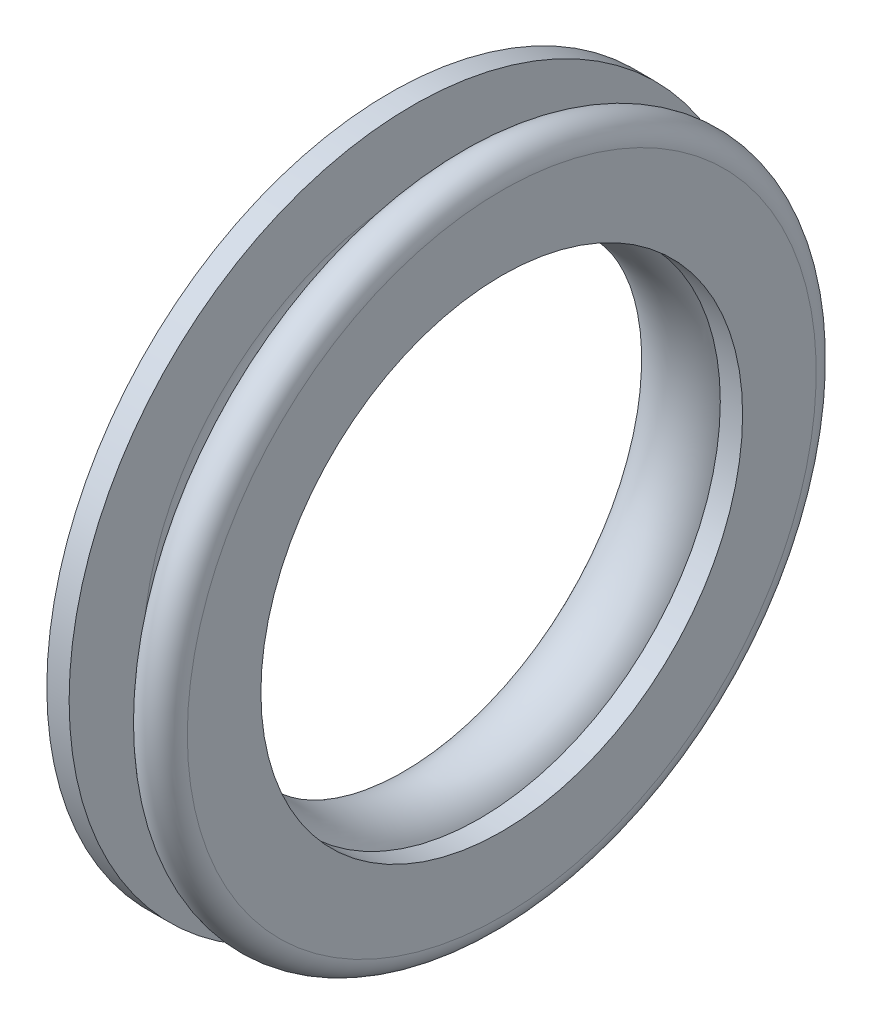
ISO-10303-21;
HEADER;
FILE_DESCRIPTION(('STEP AP214'),'2;1');
FILE_NAME('part.step','',(''),(''),'','','');
FILE_SCHEMA(('AUTOMOTIVE_DESIGN { 1 0 10303 214 1 1 1 1 }'));
ENDSEC;
DATA;
#1=APPLICATION_CONTEXT('core data for automotive mechanical design processes');
#2=APPLICATION_PROTOCOL_DEFINITION('international standard','automotive_design',2000,#1);
#3=PRODUCT_CONTEXT('',#1,'mechanical');
#4=PRODUCT('Part','Part','',(#3));
#5=PRODUCT_RELATED_PRODUCT_CATEGORY('part','',(#4));
#6=PRODUCT_DEFINITION_FORMATION('','',#4);
#7=PRODUCT_DEFINITION_CONTEXT('part definition',#1,'design');
#8=PRODUCT_DEFINITION('design','',#6,#7);
#9=PRODUCT_DEFINITION_SHAPE('','',#8);
#10=(LENGTH_UNIT() NAMED_UNIT(*) SI_UNIT(.MILLI.,.METRE.));
#11=(NAMED_UNIT(*) PLANE_ANGLE_UNIT() SI_UNIT($,.RADIAN.));
#12=(NAMED_UNIT(*) SI_UNIT($,.STERADIAN.) SOLID_ANGLE_UNIT());
#13=UNCERTAINTY_MEASURE_WITH_UNIT(LENGTH_MEASURE(1.E-05),#10,'distance_accuracy_value','');
#14=(GEOMETRIC_REPRESENTATION_CONTEXT(3) GLOBAL_UNCERTAINTY_ASSIGNED_CONTEXT((#13)) GLOBAL_UNIT_ASSIGNED_CONTEXT((#10,
#11,#12)) REPRESENTATION_CONTEXT('',''));
#15=CARTESIAN_POINT('',(0.,0.,0.));
#16=DIRECTION('',(0.,0.,1.));
#17=DIRECTION('',(1.,0.,0.));
#18=AXIS2_PLACEMENT_3D('',#15,#16,#17);
#19=CARTESIAN_POINT('',(0.,0.,0.));
#20=DIRECTION('',(-1.,0.,0.));
#21=DIRECTION('',(0.,0.,1.));
#22=AXIS2_PLACEMENT_3D('',#19,#20,#21);
#23=CYLINDRICAL_SURFACE('',#22,7.7);
#24=CARTESIAN_POINT('',(0.,0.,0.));
#25=DIRECTION('',(-1.,0.,0.));
#26=DIRECTION('',(0.,0.,1.));
#27=AXIS2_PLACEMENT_3D('',#24,#25,#26);
#28=CIRCLE('',#27,7.7);
#29=CARTESIAN_POINT('',(0.,0.,7.7));
#30=VERTEX_POINT('',#29);
#31=EDGE_CURVE('E10',#30,#30,#28,.T.);
#32=ORIENTED_EDGE('',*,*,#31,.F.);
#33=EDGE_LOOP('',(#32));
#34=FACE_BOUND('',#33,.T.);
#35=CARTESIAN_POINT('',(0.5,0.,0.));
#36=DIRECTION('',(-1.,0.,0.));
#37=DIRECTION('',(0.,0.,1.));
#38=AXIS2_PLACEMENT_3D('',#35,#36,#37);
#39=CIRCLE('',#38,7.7);
#40=CARTESIAN_POINT('',(0.5,0.,7.7));
#41=VERTEX_POINT('',#40);
#42=EDGE_CURVE('E66',#41,#41,#39,.T.);
#43=ORIENTED_EDGE('',*,*,#42,.T.);
#44=EDGE_LOOP('',(#43));
#45=FACE_BOUND('',#44,.T.);
#46=ADVANCED_FACE('F32',(#34,#45),#23,.T.);
#47=CARTESIAN_POINT('',(0.,7.7,0.));
#48=DIRECTION('',(1.,0.,0.));
#49=DIRECTION('',(0.,0.,-1.));
#50=AXIS2_PLACEMENT_3D('',#47,#48,#49);
#51=PLANE('',#50);
#52=CARTESIAN_POINT('',(0.,0.,0.));
#53=DIRECTION('',(-1.,0.,0.));
#54=DIRECTION('',(0.,0.,1.));
#55=AXIS2_PLACEMENT_3D('',#52,#53,#54);
#56=CIRCLE('',#55,6.05);
#57=CARTESIAN_POINT('',(0.,0.,6.05));
#58=VERTEX_POINT('',#57);
#59=EDGE_CURVE('E38',#58,#58,#56,.T.);
#60=ORIENTED_EDGE('',*,*,#59,.F.);
#61=EDGE_LOOP('',(#60));
#62=FACE_BOUND('',#61,.T.);
#63=ORIENTED_EDGE('',*,*,#31,.T.);
#64=EDGE_LOOP('',(#63));
#65=FACE_BOUND('',#64,.T.);
#66=ADVANCED_FACE('F115',(#62,#65),#51,.F.);
#67=CARTESIAN_POINT('',(1.,0.,0.));
#68=DIRECTION('',(-1.,0.,0.));
#69=DIRECTION('',(0.,0.,1.));
#70=AXIS2_PLACEMENT_3D('',#67,#68,#69);
#71=TOROIDAL_SURFACE('',#70,6.05,1.);
#72=CARTESIAN_POINT('',(2.,0.,0.));
#73=DIRECTION('',(-1.,0.,0.));
#74=DIRECTION('',(0.,0.,1.));
#75=AXIS2_PLACEMENT_3D('',#72,#73,#74);
#76=CIRCLE('',#75,6.05);
#77=CARTESIAN_POINT('',(2.,0.,6.05));
#78=VERTEX_POINT('',#77);
#79=EDGE_CURVE('E42',#78,#78,#76,.T.);
#80=ORIENTED_EDGE('',*,*,#79,.F.);
#81=EDGE_LOOP('',(#80));
#82=FACE_BOUND('',#81,.T.);
#83=ORIENTED_EDGE('',*,*,#59,.T.);
#84=EDGE_LOOP('',(#83));
#85=FACE_BOUND('',#84,.T.);
#86=ADVANCED_FACE('F110',(#82,#85),#71,.T.);
#87=CARTESIAN_POINT('',(2.,6.05,0.));
#88=DIRECTION('',(1.,0.,0.));
#89=DIRECTION('',(0.,0.,-1.));
#90=AXIS2_PLACEMENT_3D('',#87,#88,#89);
#91=PLANE('',#90);
#92=CARTESIAN_POINT('',(2.,0.,0.));
#93=DIRECTION('',(-1.,0.,0.));
#94=DIRECTION('',(0.,0.,1.));
#95=AXIS2_PLACEMENT_3D('',#92,#93,#94);
#96=CIRCLE('',#95,5.4);
#97=CARTESIAN_POINT('',(2.,0.,5.4));
#98=VERTEX_POINT('',#97);
#99=EDGE_CURVE('E46',#98,#98,#96,.T.);
#100=ORIENTED_EDGE('',*,*,#99,.F.);
#101=EDGE_LOOP('',(#100));
#102=FACE_BOUND('',#101,.T.);
#103=ORIENTED_EDGE('',*,*,#79,.T.);
#104=EDGE_LOOP('',(#103));
#105=FACE_BOUND('',#104,.T.);
#106=ADVANCED_FACE('F104',(#102,#105),#91,.F.);
#107=CARTESIAN_POINT('',(0.,0.,0.));
#108=DIRECTION('',(-1.,0.,0.));
#109=DIRECTION('',(0.,0.,1.));
#110=AXIS2_PLACEMENT_3D('',#107,#108,#109);
#111=CYLINDRICAL_SURFACE('',#110,5.4);
#112=CARTESIAN_POINT('',(2.5,0.,0.));
#113=DIRECTION('',(-1.,0.,0.));
#114=DIRECTION('',(0.,0.,1.));
#115=AXIS2_PLACEMENT_3D('',#112,#113,#114);
#116=CIRCLE('',#115,5.4);
#117=CARTESIAN_POINT('',(2.5,0.,5.4));
#118=VERTEX_POINT('',#117);
#119=EDGE_CURVE('E51',#118,#118,#116,.T.);
#120=ORIENTED_EDGE('',*,*,#119,.F.);
#121=EDGE_LOOP('',(#120));
#122=FACE_BOUND('',#121,.T.);
#123=ORIENTED_EDGE('',*,*,#99,.T.);
#124=EDGE_LOOP('',(#123));
#125=FACE_BOUND('',#124,.T.);
#126=ADVANCED_FACE('F98',(#122,#125),#111,.F.);
#127=CARTESIAN_POINT('',(2.5,7.05,0.));
#128=DIRECTION('',(-1.,0.,0.));
#129=DIRECTION('',(0.,0.,1.));
#130=AXIS2_PLACEMENT_3D('',#127,#128,#129);
#131=PLANE('',#130);
#132=CARTESIAN_POINT('',(2.5,0.,0.));
#133=DIRECTION('',(-1.,0.,0.));
#134=DIRECTION('',(0.,0.,1.));
#135=AXIS2_PLACEMENT_3D('',#132,#133,#134);
#136=CIRCLE('',#135,7.05);
#137=CARTESIAN_POINT('',(2.5,0.,7.05));
#138=VERTEX_POINT('',#137);
#139=EDGE_CURVE('E54',#138,#138,#136,.T.);
#140=ORIENTED_EDGE('',*,*,#139,.F.);
#141=EDGE_LOOP('',(#140));
#142=FACE_BOUND('',#141,.T.);
#143=ORIENTED_EDGE('',*,*,#119,.T.);
#144=EDGE_LOOP('',(#143));
#145=FACE_BOUND('',#144,.T.);
#146=ADVANCED_FACE('F92',(#142,#145),#131,.F.);
#147=CARTESIAN_POINT('',(2.,0.,0.));
#148=DIRECTION('',(-1.,0.,0.));
#149=DIRECTION('',(0.,0.,1.));
#150=AXIS2_PLACEMENT_3D('',#147,#148,#149);
#151=TOROIDAL_SURFACE('',#150,7.05,0.5);
#152=CARTESIAN_POINT('',(1.5,0.,0.));
#153=DIRECTION('',(-1.,0.,0.));
#154=DIRECTION('',(0.,0.,1.));
#155=AXIS2_PLACEMENT_3D('',#152,#153,#154);
#156=CIRCLE('',#155,7.05);
#157=CARTESIAN_POINT('',(1.5,0.,7.05));
#158=VERTEX_POINT('',#157);
#159=EDGE_CURVE('E57',#158,#158,#156,.T.);
#160=ORIENTED_EDGE('',*,*,#159,.F.);
#161=EDGE_LOOP('',(#160));
#162=FACE_BOUND('',#161,.T.);
#163=ORIENTED_EDGE('',*,*,#139,.T.);
#164=EDGE_LOOP('',(#163));
#165=FACE_BOUND('',#164,.T.);
#166=ADVANCED_FACE('F86',(#162,#165),#151,.T.);
#167=CARTESIAN_POINT('',(1.5,6.05,0.));
#168=DIRECTION('',(1.,0.,0.));
#169=DIRECTION('',(0.,0.,-1.));
#170=AXIS2_PLACEMENT_3D('',#167,#168,#169);
#171=PLANE('',#170);
#172=CARTESIAN_POINT('',(1.5,0.,0.));
#173=DIRECTION('',(-1.,0.,0.));
#174=DIRECTION('',(0.,0.,1.));
#175=AXIS2_PLACEMENT_3D('',#172,#173,#174);
#176=CIRCLE('',#175,6.05);
#177=CARTESIAN_POINT('',(1.5,0.,6.05));
#178=VERTEX_POINT('',#177);
#179=EDGE_CURVE('E60',#178,#178,#176,.T.);
#180=ORIENTED_EDGE('',*,*,#179,.F.);
#181=EDGE_LOOP('',(#180));
#182=FACE_BOUND('',#181,.T.);
#183=ORIENTED_EDGE('',*,*,#159,.T.);
#184=EDGE_LOOP('',(#183));
#185=FACE_BOUND('',#184,.T.);
#186=ADVANCED_FACE('F80',(#182,#185),#171,.F.);
#187=CARTESIAN_POINT('',(1.,0.,0.));
#188=DIRECTION('',(-1.,0.,0.));
#189=DIRECTION('',(0.,0.,1.));
#190=AXIS2_PLACEMENT_3D('',#187,#188,#189);
#191=TOROIDAL_SURFACE('',#190,6.05,0.5);
#192=CARTESIAN_POINT('',(0.5,0.,0.));
#193=DIRECTION('',(-1.,0.,0.));
#194=DIRECTION('',(0.,0.,1.));
#195=AXIS2_PLACEMENT_3D('',#192,#193,#194);
#196=CIRCLE('',#195,6.05);
#197=CARTESIAN_POINT('',(0.5,0.,6.05));
#198=VERTEX_POINT('',#197);
#199=EDGE_CURVE('E63',#198,#198,#196,.T.);
#200=ORIENTED_EDGE('',*,*,#199,.F.);
#201=EDGE_LOOP('',(#200));
#202=FACE_BOUND('',#201,.T.);
#203=ORIENTED_EDGE('',*,*,#179,.T.);
#204=EDGE_LOOP('',(#203));
#205=FACE_BOUND('',#204,.T.);
#206=ADVANCED_FACE('F74',(#202,#205),#191,.F.);
#207=CARTESIAN_POINT('',(0.5,7.7,0.));
#208=DIRECTION('',(-1.,0.,0.));
#209=DIRECTION('',(0.,0.,1.));
#210=AXIS2_PLACEMENT_3D('',#207,#208,#209);
#211=PLANE('',#210);
#212=ORIENTED_EDGE('',*,*,#42,.F.);
#213=EDGE_LOOP('',(#212));
#214=FACE_BOUND('',#213,.T.);
#215=ORIENTED_EDGE('',*,*,#199,.T.);
#216=EDGE_LOOP('',(#215));
#217=FACE_BOUND('',#216,.T.);
#218=ADVANCED_FACE('F71',(#214,#217),#211,.F.);
#219=CLOSED_SHELL('',(#46,#66,#86,#106,#126,#146,#166,#186,#206,#218));
#220=MANIFOLD_SOLID_BREP('B2',#219);
#221=ADVANCED_BREP_SHAPE_REPRESENTATION('',(#18,#220),#14);
#222=SHAPE_DEFINITION_REPRESENTATION(#9,#221);
ENDSEC;
END-ISO-10303-21;
